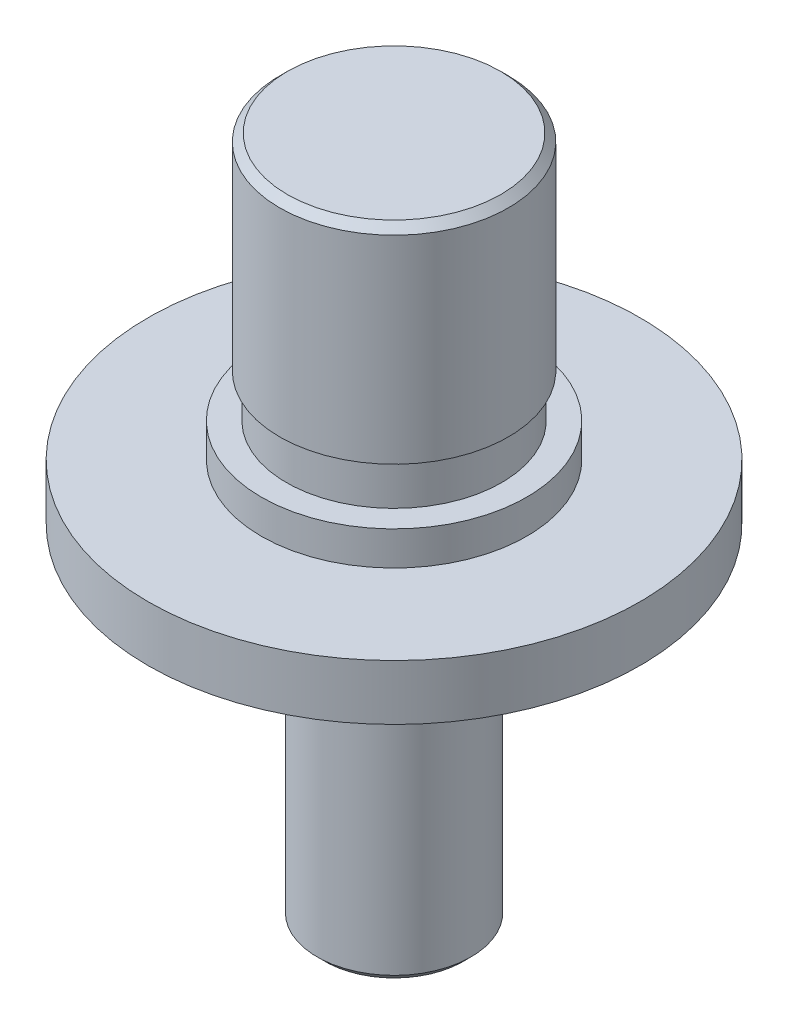
ISO-10303-21;
HEADER;
FILE_DESCRIPTION(('STEP AP214'),'2;1');
FILE_NAME('part.step','',(''),(''),'','','');
FILE_SCHEMA(('AUTOMOTIVE_DESIGN { 1 0 10303 214 1 1 1 1 }'));
ENDSEC;
DATA;
#1=APPLICATION_CONTEXT('core data for automotive mechanical design processes');
#2=APPLICATION_PROTOCOL_DEFINITION('international standard','automotive_design',2000,#1);
#3=PRODUCT_CONTEXT('',#1,'mechanical');
#4=PRODUCT('Part','Part','',(#3));
#5=PRODUCT_RELATED_PRODUCT_CATEGORY('part','',(#4));
#6=PRODUCT_DEFINITION_FORMATION('','',#4);
#7=PRODUCT_DEFINITION_CONTEXT('part definition',#1,'design');
#8=PRODUCT_DEFINITION('design','',#6,#7);
#9=PRODUCT_DEFINITION_SHAPE('','',#8);
#10=(LENGTH_UNIT() NAMED_UNIT(*) SI_UNIT(.MILLI.,.METRE.));
#11=(NAMED_UNIT(*) PLANE_ANGLE_UNIT() SI_UNIT($,.RADIAN.));
#12=(NAMED_UNIT(*) SI_UNIT($,.STERADIAN.) SOLID_ANGLE_UNIT());
#13=UNCERTAINTY_MEASURE_WITH_UNIT(LENGTH_MEASURE(1.E-05),#10,'distance_accuracy_value','');
#14=(GEOMETRIC_REPRESENTATION_CONTEXT(3) GLOBAL_UNCERTAINTY_ASSIGNED_CONTEXT((#13)) GLOBAL_UNIT_ASSIGNED_CONTEXT((#10,
#11,#12)) REPRESENTATION_CONTEXT('',''));
#15=CARTESIAN_POINT('',(0.,0.,0.));
#16=DIRECTION('',(0.,0.,1.));
#17=DIRECTION('',(1.,0.,0.));
#18=AXIS2_PLACEMENT_3D('',#15,#16,#17);
#19=CARTESIAN_POINT('',(0.,11.43,52.5));
#20=DIRECTION('',(0.,-1.,0.));
#21=DIRECTION('',(0.,0.,-1.));
#22=AXIS2_PLACEMENT_3D('',#19,#20,#21);
#23=PLANE('',#22);
#24=CARTESIAN_POINT('',(0.,11.43,0.));
#25=DIRECTION('',(0.,-1.,0.));
#26=DIRECTION('',(0.,0.,-1.));
#27=AXIS2_PLACEMENT_3D('',#24,#25,#26);
#28=CIRCLE('',#27,27.4096);
#29=CARTESIAN_POINT('',(0.,11.43,-27.4096));
#30=VERTEX_POINT('',#29);
#31=EDGE_CURVE('E75',#30,#30,#28,.T.);
#32=ORIENTED_EDGE('',*,*,#31,.T.);
#33=EDGE_LOOP('',(#32));
#34=FACE_BOUND('',#33,.T.);
#35=CARTESIAN_POINT('',(0.,11.43,0.));
#36=DIRECTION('',(0.,1.,0.));
#37=DIRECTION('',(0.,0.,1.));
#38=AXIS2_PLACEMENT_3D('',#35,#36,#37);
#39=CIRCLE('',#38,50.8);
#40=CARTESIAN_POINT('',(0.,11.43,50.8));
#41=VERTEX_POINT('',#40);
#42=EDGE_CURVE('E107',#41,#41,#39,.T.);
#43=ORIENTED_EDGE('',*,*,#42,.T.);
#44=EDGE_LOOP('',(#43));
#45=FACE_BOUND('',#44,.T.);
#46=ADVANCED_FACE('F47',(#34,#45),#23,.F.);
#47=CARTESIAN_POINT('',(0.,0.,0.));
#48=DIRECTION('',(0.,-1.,0.));
#49=DIRECTION('',(0.,0.,-1.));
#50=AXIS2_PLACEMENT_3D('',#47,#48,#49);
#51=CYLINDRICAL_SURFACE('',#50,27.4096);
#52=ORIENTED_EDGE('',*,*,#31,.F.);
#53=EDGE_LOOP('',(#52));
#54=FACE_BOUND('',#53,.T.);
#55=CARTESIAN_POINT('',(0.,18.43,0.));
#56=DIRECTION('',(0.,-1.,0.));
#57=DIRECTION('',(0.,0.,-1.));
#58=AXIS2_PLACEMENT_3D('',#55,#56,#57);
#59=CIRCLE('',#58,27.4096);
#60=CARTESIAN_POINT('',(0.,18.43,-27.4096));
#61=VERTEX_POINT('',#60);
#62=EDGE_CURVE('E79',#61,#61,#59,.T.);
#63=ORIENTED_EDGE('',*,*,#62,.T.);
#64=EDGE_LOOP('',(#63));
#65=FACE_BOUND('',#64,.T.);
#66=ADVANCED_FACE('F132',(#54,#65),#51,.T.);
#67=CARTESIAN_POINT('',(0.,18.43,27.4096));
#68=DIRECTION('',(0.,-1.,0.));
#69=DIRECTION('',(0.,0.,-1.));
#70=AXIS2_PLACEMENT_3D('',#67,#68,#69);
#71=PLANE('',#70);
#72=ORIENTED_EDGE('',*,*,#62,.F.);
#73=EDGE_LOOP('',(#72));
#74=FACE_BOUND('',#73,.T.);
#75=CARTESIAN_POINT('',(0.,18.43,0.));
#76=DIRECTION('',(0.,-1.,0.));
#77=DIRECTION('',(0.,0.,-1.));
#78=AXIS2_PLACEMENT_3D('',#75,#76,#77);
#79=CIRCLE('',#78,22.225);
#80=CARTESIAN_POINT('',(0.,18.43,-22.225));
#81=VERTEX_POINT('',#80);
#82=EDGE_CURVE('E83',#81,#81,#79,.T.);
#83=ORIENTED_EDGE('',*,*,#82,.T.);
#84=EDGE_LOOP('',(#83));
#85=FACE_BOUND('',#84,.T.);
#86=ADVANCED_FACE('F139',(#74,#85),#71,.F.);
#87=CARTESIAN_POINT('',(0.,0.,0.));
#88=DIRECTION('',(0.,-1.,0.));
#89=DIRECTION('',(0.,0.,-1.));
#90=AXIS2_PLACEMENT_3D('',#87,#88,#89);
#91=CYLINDRICAL_SURFACE('',#90,22.225);
#92=ORIENTED_EDGE('',*,*,#82,.F.);
#93=EDGE_LOOP('',(#92));
#94=FACE_BOUND('',#93,.T.);
#95=CARTESIAN_POINT('',(0.,27.305,0.));
#96=DIRECTION('',(0.,-1.,0.));
#97=DIRECTION('',(0.,0.,-1.));
#98=AXIS2_PLACEMENT_3D('',#95,#96,#97);
#99=CIRCLE('',#98,22.225);
#100=CARTESIAN_POINT('',(0.,27.305,-22.225));
#101=VERTEX_POINT('',#100);
#102=EDGE_CURVE('E87',#101,#101,#99,.T.);
#103=ORIENTED_EDGE('',*,*,#102,.T.);
#104=EDGE_LOOP('',(#103));
#105=FACE_BOUND('',#104,.T.);
#106=ADVANCED_FACE('F218',(#94,#105),#91,.T.);
#107=CARTESIAN_POINT('',(0.,27.305,22.225));
#108=DIRECTION('',(0.,1.,0.));
#109=DIRECTION('',(0.,0.,1.));
#110=AXIS2_PLACEMENT_3D('',#107,#108,#109);
#111=PLANE('',#110);
#112=ORIENTED_EDGE('',*,*,#102,.F.);
#113=EDGE_LOOP('',(#112));
#114=FACE_BOUND('',#113,.T.);
#115=CARTESIAN_POINT('',(0.,27.305,0.));
#116=DIRECTION('',(0.,-1.,0.));
#117=DIRECTION('',(0.,0.,-1.));
#118=AXIS2_PLACEMENT_3D('',#115,#116,#117);
#119=CIRCLE('',#118,23.61946);
#120=CARTESIAN_POINT('',(0.,27.305,-23.61946));
#121=VERTEX_POINT('',#120);
#122=EDGE_CURVE('E91',#121,#121,#119,.T.);
#123=ORIENTED_EDGE('',*,*,#122,.T.);
#124=EDGE_LOOP('',(#123));
#125=FACE_BOUND('',#124,.T.);
#126=ADVANCED_FACE('F227',(#114,#125),#111,.F.);
#127=CARTESIAN_POINT('',(0.,0.,0.));
#128=DIRECTION('',(0.,-1.,0.));
#129=DIRECTION('',(0.,0.,-1.));
#130=AXIS2_PLACEMENT_3D('',#127,#128,#129);
#131=CYLINDRICAL_SURFACE('',#130,23.61946);
#132=ORIENTED_EDGE('',*,*,#122,.F.);
#133=EDGE_LOOP('',(#132));
#134=FACE_BOUND('',#133,.T.);
#135=CARTESIAN_POINT('',(0.,68.2625,0.));
#136=DIRECTION('',(0.,-1.,0.));
#137=DIRECTION('',(0.,0.,-1.));
#138=AXIS2_PLACEMENT_3D('',#135,#136,#137);
#139=CIRCLE('',#138,23.61946);
#140=CARTESIAN_POINT('',(0.,68.2625,-23.61946));
#141=VERTEX_POINT('',#140);
#142=EDGE_CURVE('E95',#141,#141,#139,.T.);
#143=ORIENTED_EDGE('',*,*,#142,.T.);
#144=EDGE_LOOP('',(#143));
#145=FACE_BOUND('',#144,.T.);
#146=ADVANCED_FACE('F237',(#134,#145),#131,.T.);
#147=CARTESIAN_POINT('',(0.,69.85,0.));
#148=DIRECTION('',(0.,-1.,0.));
#149=DIRECTION('',(0.,0.,-1.));
#150=AXIS2_PLACEMENT_3D('',#147,#148,#149);
#151=CONICAL_SURFACE('',#150,22.03196,0.785398163397454);
#152=ORIENTED_EDGE('',*,*,#142,.F.);
#153=EDGE_LOOP('',(#152));
#154=FACE_BOUND('',#153,.T.);
#155=CARTESIAN_POINT('',(0.,69.85,0.));
#156=DIRECTION('',(0.,-1.,0.));
#157=DIRECTION('',(0.,0.,-1.));
#158=AXIS2_PLACEMENT_3D('',#155,#156,#157);
#159=CIRCLE('',#158,22.03196);
#160=CARTESIAN_POINT('',(0.,69.85,-22.03196));
#161=VERTEX_POINT('',#160);
#162=EDGE_CURVE('E99',#161,#161,#159,.T.);
#163=ORIENTED_EDGE('',*,*,#162,.T.);
#164=EDGE_LOOP('',(#163));
#165=FACE_BOUND('',#164,.T.);
#166=ADVANCED_FACE('F128',(#154,#165),#151,.T.);
#167=CARTESIAN_POINT('',(0.,69.8500000000012,0.));
#168=DIRECTION('',(0.,-1.,0.));
#169=DIRECTION('',(0.,0.,-1.));
#170=AXIS2_PLACEMENT_3D('',#167,#168,#169);
#171=PLANE('',#170);
#172=ORIENTED_EDGE('',*,*,#162,.F.);
#173=EDGE_LOOP('',(#172));
#174=FACE_BOUND('',#173,.T.);
#175=ADVANCED_FACE('F116',(#174),#171,.F.);
#176=CARTESIAN_POINT('',(0.,-148.492424049175,0.));
#177=DIRECTION('',(0.,1.,0.));
#178=DIRECTION('',(0.,0.,1.));
#179=AXIS2_PLACEMENT_3D('',#176,#177,#178);
#180=CYLINDRICAL_SURFACE('',#179,50.8);
#181=CARTESIAN_POINT('',(0.,0.,0.));
#182=DIRECTION('',(0.,1.,0.));
#183=DIRECTION('',(0.,0.,1.));
#184=AXIS2_PLACEMENT_3D('',#181,#182,#183);
#185=CIRCLE('',#184,50.8);
#186=CARTESIAN_POINT('',(0.,0.,50.8));
#187=VERTEX_POINT('',#186);
#188=EDGE_CURVE('E103',#187,#187,#185,.F.);
#189=CARTESIAN_POINT('',(0.,0.,50.8));
#190=CARTESIAN_POINT('',(0.,0.119062499999998,50.8));
#191=CARTESIAN_POINT('',(0.,0.238124999999996,50.8));
#192=CARTESIAN_POINT('',(0.,0.476249999999993,50.8));
#193=CARTESIAN_POINT('',(0.,0.595312499999991,50.8));
#194=CARTESIAN_POINT('',(0.,0.833437499999997,50.8));
#195=CARTESIAN_POINT('',(0.,0.952500000000004,50.8));
#196=CARTESIAN_POINT('',(0.,1.19062500000001,50.8));
#197=CARTESIAN_POINT('',(0.,1.30968750000001,50.8));
#198=CARTESIAN_POINT('',(0.,1.5478125,50.8));
#199=CARTESIAN_POINT('',(0.,1.666875,50.8));
#200=CARTESIAN_POINT('',(0.,1.905,50.8));
#201=CARTESIAN_POINT('',(0.,2.0240625,50.8));
#202=CARTESIAN_POINT('',(0.,2.26218749999999,50.8));
#203=CARTESIAN_POINT('',(0.,2.38124999999999,50.8));
#204=CARTESIAN_POINT('',(0.,2.619375,50.8));
#205=CARTESIAN_POINT('',(0.,2.73843750000001,50.8));
#206=CARTESIAN_POINT('',(0.,2.97656250000001,50.8));
#207=CARTESIAN_POINT('',(0.,3.09562500000001,50.8));
#208=CARTESIAN_POINT('',(0.,3.33375000000001,50.8));
#209=CARTESIAN_POINT('',(0.,3.4528125,50.8));
#210=CARTESIAN_POINT('',(0.,3.6909375,50.8));
#211=CARTESIAN_POINT('',(0.,3.81,50.8));
#212=CARTESIAN_POINT('',(0.,4.048125,50.8));
#213=CARTESIAN_POINT('',(0.,4.16718749999999,50.8));
#214=CARTESIAN_POINT('',(0.,4.40531249999999,50.8));
#215=CARTESIAN_POINT('',(0.,4.52437499999999,50.8));
#216=CARTESIAN_POINT('',(0.,4.76249999999999,50.8));
#217=CARTESIAN_POINT('',(0.,4.8815625,50.8));
#218=CARTESIAN_POINT('',(0.,5.11968750000001,50.8));
#219=CARTESIAN_POINT('',(0.,5.23875,50.8));
#220=CARTESIAN_POINT('',(0.,5.476875,50.8));
#221=CARTESIAN_POINT('',(0.,5.5959375,50.8));
#222=CARTESIAN_POINT('',(0.,5.8340625,50.8));
#223=CARTESIAN_POINT('',(0.,5.95312499999999,50.8));
#224=CARTESIAN_POINT('',(0.,6.19124999999999,50.8));
#225=CARTESIAN_POINT('',(0.,6.31031249999999,50.8));
#226=CARTESIAN_POINT('',(0.,6.54843749999999,50.8));
#227=CARTESIAN_POINT('',(0.,6.6675,50.8));
#228=CARTESIAN_POINT('',(0.,6.90562500000001,50.8));
#229=CARTESIAN_POINT('',(0.,7.02468750000001,50.8));
#230=CARTESIAN_POINT('',(0.,7.2628125,50.8));
#231=CARTESIAN_POINT('',(0.,7.381875,50.8));
#232=CARTESIAN_POINT('',(0.,7.62,50.8));
#233=CARTESIAN_POINT('',(0.,7.73906249999999,50.8));
#234=CARTESIAN_POINT('',(0.,7.97718749999999,50.8));
#235=CARTESIAN_POINT('',(0.,8.09624999999999,50.8));
#236=CARTESIAN_POINT('',(0.,8.33437499999999,50.8));
#237=CARTESIAN_POINT('',(0.,8.45343749999999,50.8));
#238=CARTESIAN_POINT('',(0.,8.69156249999999,50.8));
#239=CARTESIAN_POINT('',(0.,8.810625,50.8));
#240=CARTESIAN_POINT('',(0.,9.04875,50.8));
#241=CARTESIAN_POINT('',(0.,9.1678125,50.8));
#242=CARTESIAN_POINT('',(0.,9.4059375,50.8));
#243=CARTESIAN_POINT('',(0.,9.525,50.8));
#244=CARTESIAN_POINT('',(0.,9.76312499999999,50.8));
#245=CARTESIAN_POINT('',(0.,9.88218749999999,50.8));
#246=CARTESIAN_POINT('',(0.,10.1203125,50.8));
#247=CARTESIAN_POINT('',(0.,10.239375,50.8));
#248=CARTESIAN_POINT('',(0.,10.4775,50.8));
#249=CARTESIAN_POINT('',(0.,10.5965625,50.8));
#250=CARTESIAN_POINT('',(0.,10.8346875,50.8));
#251=CARTESIAN_POINT('',(0.,10.95375,50.8));
#252=CARTESIAN_POINT('',(0.,11.191875,50.8));
#253=CARTESIAN_POINT('',(0.,11.3109375,50.8));
#254=CARTESIAN_POINT('',(0.,11.43,50.8));
#255=B_SPLINE_CURVE_WITH_KNOTS('',3,(#189,#190,#191,#192,#193,#194,#195,#196,#197,#198,#199,
#200,#201,#202,#203,#204,#205,#206,#207,#208,#209,#210,#211,#212,#213,#214,#215,#216,#217,#218,
#219,#220,#221,#222,#223,#224,#225,#226,#227,#228,#229,#230,#231,#232,#233,#234,#235,#236,#237,
#238,#239,#240,#241,#242,#243,#244,#245,#246,#247,#248,#249,#250,#251,#252,#253,#254),
.UNSPECIFIED.,.F.,.F.,(4,2,2,2,2,2,2,2,2,2,2,2,2,2,2,2,2,2,2,2,2,2,2,2,2,2,2,2,2,2,2,2,4),(0.,
0.357187499999995,0.714374999999989,1.07156250000001,1.42875000000001,1.7859375,2.143125,
2.50031249999999,2.85750000000001,3.21468750000001,3.571875,3.9290625,4.28624999999999,
4.64343749999999,5.00062500000001,5.3578125,5.715,6.07218749999999,6.42937499999999,
6.78656250000001,7.14375,7.5009375,7.85812499999999,8.21531249999999,8.57249999999998,
8.92968750000001,9.286875,9.6440625,10.00125,10.3584375,10.715625,11.0728125,11.43),.UNSPECIFIED.);
#256=EDGE_CURVE('BSEAM113',#187,#41,#255,.T.);
#257=ORIENTED_EDGE('',*,*,#188,.F.);
#258=ORIENTED_EDGE('',*,*,#42,.F.);
#259=ORIENTED_EDGE('',*,*,#256,.T.);
#260=ORIENTED_EDGE('',*,*,#256,.F.);
#261=EDGE_LOOP('',(#257,#259,#258,#260));
#262=FACE_BOUND('',#261,.T.);
#263=ADVANCED_FACE('F113',(#262),#180,.T.);
#264=CARTESIAN_POINT('',(0.,-71.15048,0.));
#265=DIRECTION('',(0.,1.,0.));
#266=DIRECTION('',(0.,0.,1.));
#267=AXIS2_PLACEMENT_3D('',#264,#265,#266);
#268=PLANE('',#267);
#269=CARTESIAN_POINT('',(0.,-71.15048,0.));
#270=DIRECTION('',(0.,-1.,0.));
#271=DIRECTION('',(0.,0.,-1.));
#272=AXIS2_PLACEMENT_3D('',#269,#270,#271);
#273=CIRCLE('',#272,14.2875);
#274=CARTESIAN_POINT('',(0.,-71.15048,-14.2875));
#275=VERTEX_POINT('',#274);
#276=EDGE_CURVE('E71',#275,#275,#273,.T.);
#277=ORIENTED_EDGE('',*,*,#276,.T.);
#278=EDGE_LOOP('',(#277));
#279=FACE_BOUND('',#278,.T.);
#280=ADVANCED_FACE('F115',(#279),#268,.F.);
#281=CARTESIAN_POINT('',(0.,-69.56298,0.));
#282=DIRECTION('',(0.,1.,0.));
#283=DIRECTION('',(0.,0.,1.));
#284=AXIS2_PLACEMENT_3D('',#281,#282,#283);
#285=CONICAL_SURFACE('',#284,15.875,0.785398163397441);
#286=ORIENTED_EDGE('',*,*,#276,.F.);
#287=EDGE_LOOP('',(#286));
#288=FACE_BOUND('',#287,.T.);
#289=CARTESIAN_POINT('',(0.,-69.56298,0.));
#290=DIRECTION('',(0.,-1.,0.));
#291=DIRECTION('',(0.,0.,-1.));
#292=AXIS2_PLACEMENT_3D('',#289,#290,#291);
#293=CIRCLE('',#292,15.875);
#294=CARTESIAN_POINT('',(0.,-69.56298,-15.875));
#295=VERTEX_POINT('',#294);
#296=EDGE_CURVE('E67',#295,#295,#293,.T.);
#297=ORIENTED_EDGE('',*,*,#296,.T.);
#298=EDGE_LOOP('',(#297));
#299=FACE_BOUND('',#298,.T.);
#300=ADVANCED_FACE('F124',(#288,#299),#285,.T.);
#301=CARTESIAN_POINT('',(0.,0.,0.));
#302=DIRECTION('',(0.,-1.,0.));
#303=DIRECTION('',(0.,0.,-1.));
#304=AXIS2_PLACEMENT_3D('',#301,#302,#303);
#305=CYLINDRICAL_SURFACE('',#304,15.875);
#306=ORIENTED_EDGE('',*,*,#296,.F.);
#307=EDGE_LOOP('',(#306));
#308=FACE_BOUND('',#307,.T.);
#309=CARTESIAN_POINT('',(0.,-17.0815,0.));
#310=DIRECTION('',(0.,-1.,0.));
#311=DIRECTION('',(0.,0.,-1.));
#312=AXIS2_PLACEMENT_3D('',#309,#310,#311);
#313=CIRCLE('',#312,15.875);
#314=CARTESIAN_POINT('',(0.,-17.0815,-15.875));
#315=VERTEX_POINT('',#314);
#316=EDGE_CURVE('E61',#315,#315,#313,.T.);
#317=ORIENTED_EDGE('',*,*,#316,.T.);
#318=EDGE_LOOP('',(#317));
#319=FACE_BOUND('',#318,.T.);
#320=ADVANCED_FACE('F149',(#308,#319),#305,.T.);
#321=CARTESIAN_POINT('',(0.,-17.0815,25.0825));
#322=DIRECTION('',(0.,1.,0.));
#323=DIRECTION('',(0.,0.,1.));
#324=AXIS2_PLACEMENT_3D('',#321,#322,#323);
#325=PLANE('',#324);
#326=ORIENTED_EDGE('',*,*,#316,.F.);
#327=EDGE_LOOP('',(#326));
#328=FACE_BOUND('',#327,.T.);
#329=CARTESIAN_POINT('',(0.,-17.0815,0.));
#330=DIRECTION('',(0.,-1.,0.));
#331=DIRECTION('',(0.,0.,-1.));
#332=AXIS2_PLACEMENT_3D('',#329,#330,#331);
#333=CIRCLE('',#332,25.0825);
#334=CARTESIAN_POINT('',(0.,-17.0815,-25.0825));
#335=VERTEX_POINT('',#334);
#336=EDGE_CURVE('E56',#335,#335,#333,.T.);
#337=ORIENTED_EDGE('',*,*,#336,.T.);
#338=EDGE_LOOP('',(#337));
#339=FACE_BOUND('',#338,.T.);
#340=ADVANCED_FACE('F153',(#328,#339),#325,.F.);
#341=CARTESIAN_POINT('',(0.,0.,0.));
#342=DIRECTION('',(0.,-1.,0.));
#343=DIRECTION('',(0.,0.,-1.));
#344=AXIS2_PLACEMENT_3D('',#341,#342,#343);
#345=CYLINDRICAL_SURFACE('',#344,25.0825);
#346=ORIENTED_EDGE('',*,*,#336,.F.);
#347=EDGE_LOOP('',(#346));
#348=FACE_BOUND('',#347,.T.);
#349=CARTESIAN_POINT('',(0.,-12.319,0.));
#350=DIRECTION('',(0.,-1.,0.));
#351=DIRECTION('',(0.,0.,-1.));
#352=AXIS2_PLACEMENT_3D('',#349,#350,#351);
#353=CIRCLE('',#352,25.0825);
#354=CARTESIAN_POINT('',(0.,-12.319,-25.0825));
#355=VERTEX_POINT('',#354);
#356=EDGE_CURVE('E10',#355,#355,#353,.T.);
#357=ORIENTED_EDGE('',*,*,#356,.T.);
#358=EDGE_LOOP('',(#357));
#359=FACE_BOUND('',#358,.T.);
#360=ADVANCED_FACE('F156',(#348,#359),#345,.T.);
#361=CARTESIAN_POINT('',(0.,0.,0.));
#362=DIRECTION('',(0.,1.,0.));
#363=DIRECTION('',(0.,0.,1.));
#364=AXIS2_PLACEMENT_3D('',#361,#362,#363);
#365=CONICAL_SURFACE('',#364,27.2546720753476,0.174532925199438);
#366=ORIENTED_EDGE('',*,*,#356,.F.);
#367=EDGE_LOOP('',(#366));
#368=FACE_BOUND('',#367,.T.);
#369=CARTESIAN_POINT('',(0.,0.,0.));
#370=DIRECTION('',(0.,-1.,0.));
#371=DIRECTION('',(0.,0.,-1.));
#372=AXIS2_PLACEMENT_3D('',#369,#370,#371);
#373=CIRCLE('',#372,27.2546720753476);
#374=CARTESIAN_POINT('',(0.,0.,-27.2546720753476));
#375=VERTEX_POINT('',#374);
#376=EDGE_CURVE('E51',#375,#375,#373,.T.);
#377=ORIENTED_EDGE('',*,*,#376,.T.);
#378=EDGE_LOOP('',(#377));
#379=FACE_BOUND('',#378,.T.);
#380=ADVANCED_FACE('F49',(#368,#379),#365,.T.);
#381=CARTESIAN_POINT('',(0.,0.,0.));
#382=DIRECTION('',(0.,1.,0.));
#383=DIRECTION('',(0.,0.,1.));
#384=AXIS2_PLACEMENT_3D('',#381,#382,#383);
#385=PLANE('',#384);
#386=ORIENTED_EDGE('',*,*,#376,.F.);
#387=EDGE_LOOP('',(#386));
#388=FACE_BOUND('',#387,.T.);
#389=ORIENTED_EDGE('',*,*,#188,.T.);
#390=EDGE_LOOP('',(#389));
#391=FACE_BOUND('',#390,.T.);
#392=ADVANCED_FACE('F144',(#388,#391),#385,.F.);
#393=CLOSED_SHELL('',(#46,#66,#86,#106,#126,#146,#166,#175,#263,#280,#300,#320,#340,#360,#380,#392));
#394=MANIFOLD_SOLID_BREP('B2',#393);
#395=ADVANCED_BREP_SHAPE_REPRESENTATION('',(#18,#394),#14);
#396=SHAPE_DEFINITION_REPRESENTATION(#9,#395);
ENDSEC;
END-ISO-10303-21;
